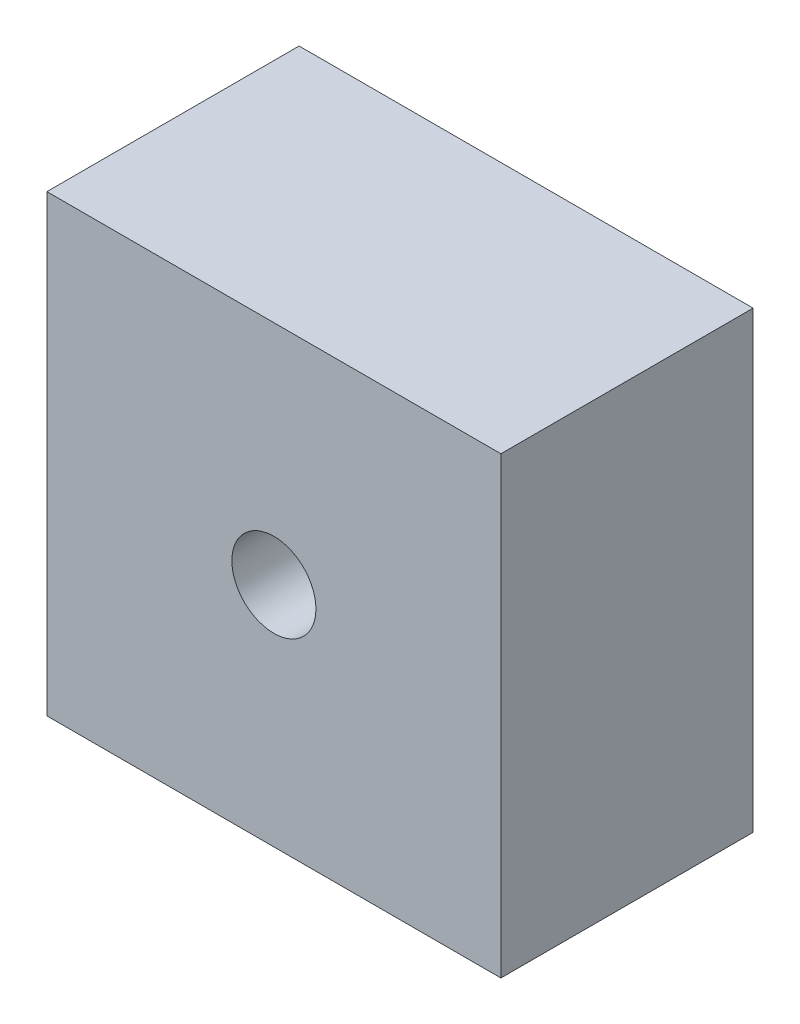
ISO-10303-21;
HEADER;
FILE_DESCRIPTION(('STEP AP214'),'2;1');
FILE_NAME('part.step','',(''),(''),'','','');
FILE_SCHEMA(('AUTOMOTIVE_DESIGN { 1 0 10303 214 1 1 1 1 }'));
ENDSEC;
DATA;
#1=APPLICATION_CONTEXT('core data for automotive mechanical design processes');
#2=APPLICATION_PROTOCOL_DEFINITION('international standard','automotive_design',2000,#1);
#3=PRODUCT_CONTEXT('',#1,'mechanical');
#4=PRODUCT('Part','Part','',(#3));
#5=PRODUCT_RELATED_PRODUCT_CATEGORY('part','',(#4));
#6=PRODUCT_DEFINITION_FORMATION('','',#4);
#7=PRODUCT_DEFINITION_CONTEXT('part definition',#1,'design');
#8=PRODUCT_DEFINITION('design','',#6,#7);
#9=PRODUCT_DEFINITION_SHAPE('','',#8);
#10=(LENGTH_UNIT() NAMED_UNIT(*) SI_UNIT(.MILLI.,.METRE.));
#11=(NAMED_UNIT(*) PLANE_ANGLE_UNIT() SI_UNIT($,.RADIAN.));
#12=(NAMED_UNIT(*) SI_UNIT($,.STERADIAN.) SOLID_ANGLE_UNIT());
#13=UNCERTAINTY_MEASURE_WITH_UNIT(LENGTH_MEASURE(1.E-05),#10,'distance_accuracy_value','');
#14=(GEOMETRIC_REPRESENTATION_CONTEXT(3) GLOBAL_UNCERTAINTY_ASSIGNED_CONTEXT((#13)) GLOBAL_UNIT_ASSIGNED_CONTEXT((#10,
#11,#12)) REPRESENTATION_CONTEXT('',''));
#15=CARTESIAN_POINT('',(0.,0.,0.));
#16=DIRECTION('',(0.,0.,1.));
#17=DIRECTION('',(1.,0.,0.));
#18=AXIS2_PLACEMENT_3D('',#15,#16,#17);
#19=CARTESIAN_POINT('',(0.,0.,0.003500000000031));
#20=DIRECTION('',(0.,0.,1.));
#21=DIRECTION('',(1.,0.,0.));
#22=AXIS2_PLACEMENT_3D('',#19,#20,#21);
#23=PLANE('',#22);
#24=CARTESIAN_POINT('',(27.,27.,0.003500000000031));
#25=DIRECTION('',(0.,0.,1.));
#26=DIRECTION('',(1.,0.,0.));
#27=AXIS2_PLACEMENT_3D('',#24,#25,#26);
#28=CIRCLE('',#27,5.);
#29=CARTESIAN_POINT('',(32.,27.,0.003500000000031));
#30=VERTEX_POINT('',#29);
#31=EDGE_CURVE('E18',#30,#30,#28,.T.);
#32=ORIENTED_EDGE('',*,*,#31,.T.);
#33=EDGE_LOOP('',(#32));
#34=FACE_BOUND('',#33,.T.);
#35=DIRECTION('',(0.,1.,0.));
#36=VECTOR('',#35,1.);
#37=CARTESIAN_POINT('',(54.,0.,0.003500000000031));
#38=LINE('',#37,#36);
#39=CARTESIAN_POINT('',(54.,0.,0.003500000000031));
#40=VERTEX_POINT('',#39);
#41=CARTESIAN_POINT('',(54.,54.,0.003500000000031));
#42=VERTEX_POINT('',#41);
#43=EDGE_CURVE('E59',#40,#42,#38,.T.);
#44=ORIENTED_EDGE('',*,*,#43,.F.);
#45=DIRECTION('',(1.,0.,0.));
#46=VECTOR('',#45,1.);
#47=CARTESIAN_POINT('',(0.,0.,0.003500000000031));
#48=LINE('',#47,#46);
#49=CARTESIAN_POINT('',(0.,0.,0.003500000000031));
#50=VERTEX_POINT('',#49);
#51=EDGE_CURVE('E53',#40,#50,#48,.F.);
#52=ORIENTED_EDGE('',*,*,#51,.T.);
#53=DIRECTION('',(0.,1.,0.));
#54=VECTOR('',#53,1.);
#55=CARTESIAN_POINT('',(0.,0.,0.003500000000031));
#56=LINE('',#55,#54);
#57=CARTESIAN_POINT('',(0.,54.,0.003500000000031));
#58=VERTEX_POINT('',#57);
#59=EDGE_CURVE('E57',#50,#58,#56,.T.);
#60=ORIENTED_EDGE('',*,*,#59,.T.);
#61=DIRECTION('',(1.,0.,0.));
#62=VECTOR('',#61,1.);
#63=CARTESIAN_POINT('',(0.,54.,0.003500000000031));
#64=LINE('',#63,#62);
#65=EDGE_CURVE('E79',#42,#58,#64,.F.);
#66=ORIENTED_EDGE('',*,*,#65,.F.);
#67=EDGE_LOOP('',(#44,#52,#60,#66));
#68=FACE_BOUND('',#67,.T.);
#69=ADVANCED_FACE('F15',(#34,#68),#23,.F.);
#70=CARTESIAN_POINT('',(0.,0.,0.003500000000031));
#71=DIRECTION('',(1.,0.,0.));
#72=DIRECTION('',(0.,0.,-1.));
#73=AXIS2_PLACEMENT_3D('',#70,#71,#72);
#74=PLANE('',#73);
#75=DIRECTION('',(0.,0.,1.));
#76=VECTOR('',#75,1.);
#77=CARTESIAN_POINT('',(0.,54.,0.003500000000031));
#78=LINE('',#77,#76);
#79=CARTESIAN_POINT('',(0.,54.,30.0035));
#80=VERTEX_POINT('',#79);
#81=EDGE_CURVE('E67',#58,#80,#78,.T.);
#82=ORIENTED_EDGE('',*,*,#81,.F.);
#83=ORIENTED_EDGE('',*,*,#59,.F.);
#84=DIRECTION('',(0.,0.,1.));
#85=VECTOR('',#84,1.);
#86=CARTESIAN_POINT('',(0.,0.,0.003500000000031));
#87=LINE('',#86,#85);
#88=CARTESIAN_POINT('',(0.,0.,30.0035));
#89=VERTEX_POINT('',#88);
#90=EDGE_CURVE('E61',#50,#89,#87,.T.);
#91=ORIENTED_EDGE('',*,*,#90,.T.);
#92=DIRECTION('',(0.,1.,0.));
#93=VECTOR('',#92,1.);
#94=CARTESIAN_POINT('',(0.,0.,30.0035));
#95=LINE('',#94,#93);
#96=EDGE_CURVE('E83',#80,#89,#95,.F.);
#97=ORIENTED_EDGE('',*,*,#96,.F.);
#98=EDGE_LOOP('',(#82,#83,#91,#97));
#99=FACE_BOUND('',#98,.T.);
#100=ADVANCED_FACE('F64',(#99),#74,.F.);
#101=CARTESIAN_POINT('',(0.,0.,0.003500000000031));
#102=DIRECTION('',(0.,1.,0.));
#103=DIRECTION('',(0.,0.,1.));
#104=AXIS2_PLACEMENT_3D('',#101,#102,#103);
#105=PLANE('',#104);
#106=DIRECTION('',(1.,0.,0.));
#107=VECTOR('',#106,1.);
#108=CARTESIAN_POINT('',(0.,0.,30.0035));
#109=LINE('',#108,#107);
#110=CARTESIAN_POINT('',(54.,0.,30.0035));
#111=VERTEX_POINT('',#110);
#112=EDGE_CURVE('E72',#89,#111,#109,.T.);
#113=ORIENTED_EDGE('',*,*,#112,.F.);
#114=ORIENTED_EDGE('',*,*,#90,.F.);
#115=ORIENTED_EDGE('',*,*,#51,.F.);
#116=DIRECTION('',(0.,0.,-1.));
#117=VECTOR('',#116,1.);
#118=CARTESIAN_POINT('',(54.,0.,0.003500000000031));
#119=LINE('',#118,#117);
#120=EDGE_CURVE('E74',#111,#40,#119,.T.);
#121=ORIENTED_EDGE('',*,*,#120,.F.);
#122=EDGE_LOOP('',(#113,#114,#115,#121));
#123=FACE_BOUND('',#122,.T.);
#124=ADVANCED_FACE('F70',(#123),#105,.F.);
#125=CARTESIAN_POINT('',(54.,0.,0.003500000000031));
#126=DIRECTION('',(1.,0.,0.));
#127=DIRECTION('',(0.,0.,-1.));
#128=AXIS2_PLACEMENT_3D('',#125,#126,#127);
#129=PLANE('',#128);
#130=DIRECTION('',(0.,0.,1.));
#131=VECTOR('',#130,1.);
#132=CARTESIAN_POINT('',(54.,54.,0.003500000000031));
#133=LINE('',#132,#131);
#134=CARTESIAN_POINT('',(54.,54.,30.0035));
#135=VERTEX_POINT('',#134);
#136=EDGE_CURVE('E32',#135,#42,#133,.F.);
#137=ORIENTED_EDGE('',*,*,#136,.F.);
#138=DIRECTION('',(0.,1.,0.));
#139=VECTOR('',#138,1.);
#140=CARTESIAN_POINT('',(54.,0.,30.0035));
#141=LINE('',#140,#139);
#142=EDGE_CURVE('E86',#111,#135,#141,.T.);
#143=ORIENTED_EDGE('',*,*,#142,.F.);
#144=ORIENTED_EDGE('',*,*,#120,.T.);
#145=ORIENTED_EDGE('',*,*,#43,.T.);
#146=EDGE_LOOP('',(#137,#143,#144,#145));
#147=FACE_BOUND('',#146,.T.);
#148=ADVANCED_FACE('F94',(#147),#129,.T.);
#149=CARTESIAN_POINT('',(0.,54.,0.003500000000031));
#150=DIRECTION('',(0.,1.,0.));
#151=DIRECTION('',(0.,0.,1.));
#152=AXIS2_PLACEMENT_3D('',#149,#150,#151);
#153=PLANE('',#152);
#154=DIRECTION('',(1.,0.,0.));
#155=VECTOR('',#154,1.);
#156=CARTESIAN_POINT('',(0.,54.,30.0035));
#157=LINE('',#156,#155);
#158=EDGE_CURVE('E24',#135,#80,#157,.F.);
#159=ORIENTED_EDGE('',*,*,#158,.F.);
#160=ORIENTED_EDGE('',*,*,#136,.T.);
#161=ORIENTED_EDGE('',*,*,#65,.T.);
#162=ORIENTED_EDGE('',*,*,#81,.T.);
#163=EDGE_LOOP('',(#159,#160,#161,#162));
#164=FACE_BOUND('',#163,.T.);
#165=ADVANCED_FACE('F93',(#164),#153,.T.);
#166=CARTESIAN_POINT('',(27.,27.,0.003500000000031));
#167=DIRECTION('',(0.,0.,1.));
#168=DIRECTION('',(1.,0.,0.));
#169=AXIS2_PLACEMENT_3D('',#166,#167,#168);
#170=CYLINDRICAL_SURFACE('',#169,5.);
#171=ORIENTED_EDGE('',*,*,#31,.F.);
#172=EDGE_LOOP('',(#171));
#173=FACE_BOUND('',#172,.T.);
#174=CARTESIAN_POINT('',(27.,27.,30.0035));
#175=DIRECTION('',(0.,0.,1.));
#176=DIRECTION('',(1.,0.,0.));
#177=AXIS2_PLACEMENT_3D('',#174,#175,#176);
#178=CIRCLE('',#177,5.);
#179=CARTESIAN_POINT('',(32.,27.,30.0035));
#180=VERTEX_POINT('',#179);
#181=EDGE_CURVE('E9',#180,#180,#178,.F.);
#182=ORIENTED_EDGE('',*,*,#181,.F.);
#183=EDGE_LOOP('',(#182));
#184=FACE_BOUND('',#183,.T.);
#185=ADVANCED_FACE('F102',(#173,#184),#170,.F.);
#186=CARTESIAN_POINT('',(0.,0.,30.0035));
#187=DIRECTION('',(0.,0.,1.));
#188=DIRECTION('',(1.,0.,0.));
#189=AXIS2_PLACEMENT_3D('',#186,#187,#188);
#190=PLANE('',#189);
#191=ORIENTED_EDGE('',*,*,#181,.T.);
#192=EDGE_LOOP('',(#191));
#193=FACE_BOUND('',#192,.T.);
#194=ORIENTED_EDGE('',*,*,#142,.T.);
#195=ORIENTED_EDGE('',*,*,#158,.T.);
#196=ORIENTED_EDGE('',*,*,#96,.T.);
#197=ORIENTED_EDGE('',*,*,#112,.T.);
#198=EDGE_LOOP('',(#194,#195,#196,#197));
#199=FACE_BOUND('',#198,.T.);
#200=ADVANCED_FACE('F91',(#193,#199),#190,.T.);
#201=CLOSED_SHELL('',(#69,#100,#124,#148,#165,#185,#200));
#202=MANIFOLD_SOLID_BREP('B1',#201);
#203=ADVANCED_BREP_SHAPE_REPRESENTATION('',(#18,#202),#14);
#204=SHAPE_DEFINITION_REPRESENTATION(#9,#203);
ENDSEC;
END-ISO-10303-21;
